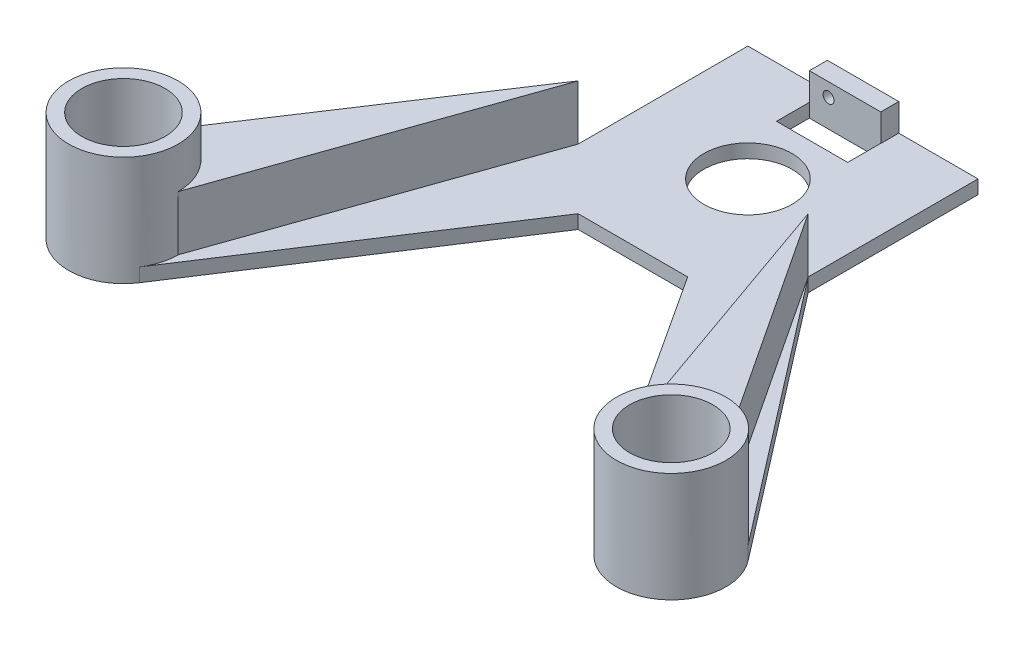
ISO-10303-21;
HEADER;
FILE_DESCRIPTION(('STEP AP214'),'2;1');
FILE_NAME('part.step','',(''),(''),'','','');
FILE_SCHEMA(('AUTOMOTIVE_DESIGN { 1 0 10303 214 1 1 1 1 }'));
ENDSEC;
DATA;
#1=APPLICATION_CONTEXT('core data for automotive mechanical design processes');
#2=APPLICATION_PROTOCOL_DEFINITION('international standard','automotive_design',2000,#1);
#3=PRODUCT_CONTEXT('',#1,'mechanical');
#4=PRODUCT('Part','Part','',(#3));
#5=PRODUCT_RELATED_PRODUCT_CATEGORY('part','',(#4));
#6=PRODUCT_DEFINITION_FORMATION('','',#4);
#7=PRODUCT_DEFINITION_CONTEXT('part definition',#1,'design');
#8=PRODUCT_DEFINITION('design','',#6,#7);
#9=PRODUCT_DEFINITION_SHAPE('','',#8);
#10=(LENGTH_UNIT() NAMED_UNIT(*) SI_UNIT(.MILLI.,.METRE.));
#11=(NAMED_UNIT(*) PLANE_ANGLE_UNIT() SI_UNIT($,.RADIAN.));
#12=(NAMED_UNIT(*) SI_UNIT($,.STERADIAN.) SOLID_ANGLE_UNIT());
#13=UNCERTAINTY_MEASURE_WITH_UNIT(LENGTH_MEASURE(1.E-05),#10,'distance_accuracy_value','');
#14=(GEOMETRIC_REPRESENTATION_CONTEXT(3) GLOBAL_UNCERTAINTY_ASSIGNED_CONTEXT((#13)) GLOBAL_UNIT_ASSIGNED_CONTEXT((#10,
#11,#12)) REPRESENTATION_CONTEXT('',''));
#15=CARTESIAN_POINT('',(0.,0.,0.));
#16=DIRECTION('',(0.,0.,1.));
#17=DIRECTION('',(1.,0.,0.));
#18=AXIS2_PLACEMENT_3D('',#15,#16,#17);
#19=CARTESIAN_POINT('',(0.,2.5,0.));
#20=DIRECTION('',(0.,-1.,0.));
#21=DIRECTION('',(0.,0.,-1.));
#22=AXIS2_PLACEMENT_3D('',#19,#20,#21);
#23=PLANE('',#22);
#24=CARTESIAN_POINT('',(0.,2.5,0.));
#25=DIRECTION('',(0.,1.,0.));
#26=DIRECTION('',(0.,0.,1.));
#27=AXIS2_PLACEMENT_3D('',#24,#25,#26);
#28=CIRCLE('',#27,8.05);
#29=CARTESIAN_POINT('',(0.,2.5,8.05));
#30=VERTEX_POINT('',#29);
#31=EDGE_CURVE('E377',#30,#30,#28,.T.);
#32=ORIENTED_EDGE('',*,*,#31,.F.);
#33=EDGE_LOOP('',(#32));
#34=FACE_BOUND('',#33,.T.);
#35=DIRECTION('',(0.,0.,1.));
#36=VECTOR('',#35,1.);
#37=CARTESIAN_POINT('',(-6.5,2.5,-17.7149420605666));
#38=LINE('',#37,#36);
#39=CARTESIAN_POINT('',(-6.5,2.5,-21.));
#40=VERTEX_POINT('',#39);
#41=CARTESIAN_POINT('',(-6.5,2.5,-17.7149420605666));
#42=VERTEX_POINT('',#41);
#43=EDGE_CURVE('E61',#40,#42,#38,.T.);
#44=ORIENTED_EDGE('',*,*,#43,.F.);
#45=DIRECTION('',(-1.,0.,0.));
#46=VECTOR('',#45,1.);
#47=CARTESIAN_POINT('',(-21.,2.5,-21.));
#48=LINE('',#47,#46);
#49=CARTESIAN_POINT('',(-21.,2.5,-21.));
#50=VERTEX_POINT('',#49);
#51=EDGE_CURVE('E385',#40,#50,#48,.T.);
#52=ORIENTED_EDGE('',*,*,#51,.T.);
#53=DIRECTION('',(0.,0.,1.));
#54=VECTOR('',#53,1.);
#55=CARTESIAN_POINT('',(-21.,2.5,21.));
#56=LINE('',#55,#54);
#57=CARTESIAN_POINT('',(-21.,2.5,9.99999999999999));
#58=VERTEX_POINT('',#57);
#59=EDGE_CURVE('E389',#50,#58,#56,.T.);
#60=ORIENTED_EDGE('',*,*,#59,.T.);
#61=DIRECTION('',(0.331906211589928,0.,-0.943312390837745));
#62=VECTOR('',#61,1.);
#63=CARTESIAN_POINT('',(-21.,2.5,9.99999999999999));
#64=LINE('',#63,#62);
#65=CARTESIAN_POINT('',(-39.9999999999521,2.5,64.0000000000478));
#66=VERTEX_POINT('',#65);
#67=EDGE_CURVE('E269',#66,#58,#64,.T.);
#68=ORIENTED_EDGE('',*,*,#67,.F.);
#69=CARTESIAN_POINT('',(-49.9999999999521,2.5,64.0000000000478));
#70=DIRECTION('',(0.,-1.,0.));
#71=DIRECTION('',(0.,0.,-1.));
#72=AXIS2_PLACEMENT_3D('',#69,#70,#71);
#73=CIRCLE('',#72,9.99999999999999);
#74=CARTESIAN_POINT('',(-41.6253017020287,2.5,69.4648356260076));
#75=VERTEX_POINT('',#74);
#76=EDGE_CURVE('E307',#66,#75,#73,.T.);
#77=ORIENTED_EDGE('',*,*,#76,.T.);
#78=DIRECTION('',(-0.546483562595981,0.,0.837469829792336));
#79=VECTOR('',#78,1.);
#80=CARTESIAN_POINT('',(2.59737626105884,2.5,1.69489500642385));
#81=LINE('',#80,#79);
#82=CARTESIAN_POINT('',(-10.,2.5,21.));
#83=VERTEX_POINT('',#82);
#84=EDGE_CURVE('E318',#83,#75,#81,.T.);
#85=ORIENTED_EDGE('',*,*,#84,.F.);
#86=DIRECTION('',(1.,0.,0.));
#87=VECTOR('',#86,1.);
#88=CARTESIAN_POINT('',(-21.,2.5,21.));
#89=LINE('',#88,#87);
#90=CARTESIAN_POINT('',(10.,2.5,21.));
#91=VERTEX_POINT('',#90);
#92=EDGE_CURVE('E392',#83,#91,#89,.T.);
#93=ORIENTED_EDGE('',*,*,#92,.T.);
#94=DIRECTION('',(0.546483562596984,0.,0.837469829791681));
#95=VECTOR('',#94,1.);
#96=CARTESIAN_POINT('',(-2.59737626107993,2.5,1.69489500644205));
#97=LINE('',#96,#95);
#98=CARTESIAN_POINT('',(41.6253017020857,2.5,69.4648356259681));
#99=VERTEX_POINT('',#98);
#100=EDGE_CURVE('E360',#91,#99,#97,.T.);
#101=ORIENTED_EDGE('',*,*,#100,.T.);
#102=CARTESIAN_POINT('',(50.0000000000025,2.5,63.9999999999982));
#103=DIRECTION('',(0.,-1.,0.));
#104=DIRECTION('',(0.,0.,-1.));
#105=AXIS2_PLACEMENT_3D('',#102,#103,#104);
#106=CIRCLE('',#105,10.);
#107=CARTESIAN_POINT('',(40.0000000000025,2.5,63.9999999999982));
#108=VERTEX_POINT('',#107);
#109=EDGE_CURVE('E298',#99,#108,#106,.T.);
#110=ORIENTED_EDGE('',*,*,#109,.T.);
#111=DIRECTION('',(0.331906211590982,0.,0.943312390837374));
#112=VECTOR('',#111,1.);
#113=CARTESIAN_POINT('',(21.,2.5,10.));
#114=LINE('',#113,#112);
#115=CARTESIAN_POINT('',(21.,2.5,10.));
#116=VERTEX_POINT('',#115);
#117=EDGE_CURVE('E251',#116,#108,#114,.T.);
#118=ORIENTED_EDGE('',*,*,#117,.F.);
#119=DIRECTION('',(0.,0.,-1.));
#120=VECTOR('',#119,1.);
#121=CARTESIAN_POINT('',(21.,2.5,21.));
#122=LINE('',#121,#120);
#123=CARTESIAN_POINT('',(21.,2.5,-21.));
#124=VERTEX_POINT('',#123);
#125=EDGE_CURVE('E383',#116,#124,#122,.T.);
#126=ORIENTED_EDGE('',*,*,#125,.T.);
#127=CARTESIAN_POINT('',(6.53314015738046,2.5,-21.));
#128=VERTEX_POINT('',#127);
#129=EDGE_CURVE('E387',#124,#128,#48,.T.);
#130=ORIENTED_EDGE('',*,*,#129,.T.);
#131=DIRECTION('',(0.,0.,-1.));
#132=VECTOR('',#131,1.);
#133=CARTESIAN_POINT('',(6.53314015738047,2.5,-17.7149420605666));
#134=LINE('',#133,#132);
#135=CARTESIAN_POINT('',(6.53314015738047,2.5,-17.7149420605666));
#136=VERTEX_POINT('',#135);
#137=EDGE_CURVE('E54',#136,#128,#134,.T.);
#138=ORIENTED_EDGE('',*,*,#137,.F.);
#139=DIRECTION('',(1.,0.,0.));
#140=VECTOR('',#139,1.);
#141=CARTESIAN_POINT('',(-6.5,2.5,-17.7149420605666));
#142=LINE('',#141,#140);
#143=CARTESIAN_POINT('',(6.50000000000001,2.5,-17.7149420605666));
#144=VERTEX_POINT('',#143);
#145=EDGE_CURVE('E756',#144,#136,#142,.T.);
#146=ORIENTED_EDGE('',*,*,#145,.F.);
#147=DIRECTION('',(0.,0.,1.));
#148=VECTOR('',#147,1.);
#149=CARTESIAN_POINT('',(6.5,2.5,0.));
#150=LINE('',#149,#148);
#151=CARTESIAN_POINT('',(6.5,2.5,-11.7149420605666));
#152=VERTEX_POINT('',#151);
#153=EDGE_CURVE('E233',#144,#152,#150,.T.);
#154=ORIENTED_EDGE('',*,*,#153,.T.);
#155=DIRECTION('',(-1.,0.,0.));
#156=VECTOR('',#155,1.);
#157=CARTESIAN_POINT('',(0.,2.5,-11.7149420605666));
#158=LINE('',#157,#156);
#159=CARTESIAN_POINT('',(-6.5,2.5,-11.7149420605666));
#160=VERTEX_POINT('',#159);
#161=EDGE_CURVE('E241',#152,#160,#158,.T.);
#162=ORIENTED_EDGE('',*,*,#161,.T.);
#163=DIRECTION('',(0.,0.,-1.));
#164=VECTOR('',#163,1.);
#165=CARTESIAN_POINT('',(-6.5,2.5,0.));
#166=LINE('',#165,#164);
#167=EDGE_CURVE('E244',#160,#42,#166,.T.);
#168=ORIENTED_EDGE('',*,*,#167,.T.);
#169=EDGE_LOOP('',(#44,#52,#60,#68,#77,#85,#93,#101,#110,#118,#126,#130,#138,#146,#154,#162,#168));
#170=FACE_BOUND('',#169,.T.);
#171=ADVANCED_FACE('F37',(#34,#170),#23,.F.);
#172=DIRECTION('',(-0.550313362133871,0.,-0.834958204616803));
#173=VECTOR('',#172,1.);
#174=CARTESIAN_POINT('',(21.,2.5,10.));
#175=LINE('',#174,#173);
#176=CARTESIAN_POINT('',(50.0000000000025,2.5,53.9999999999982));
#177=VERTEX_POINT('',#176);
#178=EDGE_CURVE('E246',#177,#116,#175,.T.);
#179=ORIENTED_EDGE('',*,*,#178,.F.);
#180=CARTESIAN_POINT('',(57.9200140129701,2.5,57.8948072893299));
#181=VERTEX_POINT('',#180);
#182=EDGE_CURVE('E297',#177,#181,#106,.T.);
#183=ORIENTED_EDGE('',*,*,#182,.T.);
#184=DIRECTION('',(0.610519271066832,0.,0.792001401296755));
#185=VECTOR('',#184,1.);
#186=CARTESIAN_POINT('',(8.33726943074045,2.5,-6.42683667883594));
#187=LINE('',#186,#185);
#188=EDGE_CURVE('E349',#116,#181,#187,.T.);
#189=ORIENTED_EDGE('',*,*,#188,.F.);
#190=EDGE_LOOP('',(#179,#183,#189));
#191=FACE_BOUND('',#190,.T.);
#192=ADVANCED_FACE('F465',(#191),#23,.F.);
#193=CARTESIAN_POINT('',(50.0000000000025,0.,63.9999999999982));
#194=DIRECTION('',(0.,1.,0.));
#195=DIRECTION('',(0.,0.,1.));
#196=AXIS2_PLACEMENT_3D('',#193,#194,#195);
#197=CYLINDRICAL_SURFACE('',#196,10.);
#198=CARTESIAN_POINT('',(50.0000000000025,20.,63.9999999999982));
#199=DIRECTION('',(0.,-1.,0.));
#200=DIRECTION('',(0.,0.,-1.));
#201=AXIS2_PLACEMENT_3D('',#198,#199,#200);
#202=CIRCLE('',#201,10.);
#203=CARTESIAN_POINT('',(50.0000000000025,20.,53.9999999999982));
#204=VERTEX_POINT('',#203);
#205=EDGE_CURVE('E294',#204,#204,#202,.T.);
#206=ORIENTED_EDGE('',*,*,#205,.T.);
#207=EDGE_LOOP('',(#206));
#208=FACE_BOUND('',#207,.T.);
#209=ORIENTED_EDGE('',*,*,#182,.F.);
#210=DIRECTION('',(0.,-1.,0.));
#211=VECTOR('',#210,1.);
#212=CARTESIAN_POINT('',(50.0000000000025,12.5,53.9999999999982));
#213=LINE('',#212,#211);
#214=CARTESIAN_POINT('',(50.0000000000025,12.5,53.9999999999982));
#215=VERTEX_POINT('',#214);
#216=EDGE_CURVE('E257',#215,#177,#213,.T.);
#217=ORIENTED_EDGE('',*,*,#216,.F.);
#218=CARTESIAN_POINT('',(50.0000000000025,12.5,63.9999999999982));
#219=DIRECTION('',(0.,-1.,0.));
#220=DIRECTION('',(0.,0.,1.));
#221=AXIS2_PLACEMENT_3D('',#218,#219,#220);
#222=CIRCLE('',#221,10.);
#223=CARTESIAN_POINT('',(40.0000000000025,12.5,63.9999999999982));
#224=VERTEX_POINT('',#223);
#225=EDGE_CURVE('E254',#224,#215,#222,.T.);
#226=ORIENTED_EDGE('',*,*,#225,.F.);
#227=DIRECTION('',(0.,-1.,0.));
#228=VECTOR('',#227,1.);
#229=CARTESIAN_POINT('',(40.0000000000025,12.5,63.9999999999982));
#230=LINE('',#229,#228);
#231=EDGE_CURVE('E264',#224,#108,#230,.T.);
#232=ORIENTED_EDGE('',*,*,#231,.T.);
#233=ORIENTED_EDGE('',*,*,#109,.F.);
#234=DIRECTION('',(0.,1.,0.));
#235=VECTOR('',#234,1.);
#236=CARTESIAN_POINT('',(41.6253017020857,0.,69.4648356259681));
#237=LINE('',#236,#235);
#238=CARTESIAN_POINT('',(41.6253017020857,0.,69.4648356259681));
#239=VERTEX_POINT('',#238);
#240=EDGE_CURVE('E357',#239,#99,#237,.T.);
#241=ORIENTED_EDGE('',*,*,#240,.F.);
#242=CARTESIAN_POINT('',(50.0000000000025,0.,63.9999999999982));
#243=DIRECTION('',(0.,1.,0.));
#244=DIRECTION('',(0.,0.,1.));
#245=AXIS2_PLACEMENT_3D('',#242,#243,#244);
#246=CIRCLE('',#245,10.);
#247=CARTESIAN_POINT('',(57.9200140129701,0.,57.8948072893299));
#248=VERTEX_POINT('',#247);
#249=EDGE_CURVE('E352',#239,#248,#246,.T.);
#250=ORIENTED_EDGE('',*,*,#249,.T.);
#251=DIRECTION('',(0.,1.,0.));
#252=VECTOR('',#251,1.);
#253=CARTESIAN_POINT('',(57.9200140129701,0.,57.8948072893299));
#254=LINE('',#253,#252);
#255=EDGE_CURVE('E372',#248,#181,#254,.T.);
#256=ORIENTED_EDGE('',*,*,#255,.T.);
#257=EDGE_LOOP('',(#209,#217,#226,#232,#233,#241,#250,#256));
#258=FACE_BOUND('',#257,.T.);
#259=ADVANCED_FACE('F455',(#208,#258),#197,.T.);
#260=DIRECTION('',(-0.550313362132772,0.,0.834958204617527));
#261=VECTOR('',#260,1.);
#262=CARTESIAN_POINT('',(-49.9999999999521,2.5,54.0000000000478));
#263=LINE('',#262,#261);
#264=CARTESIAN_POINT('',(-49.9999999999521,2.5,54.0000000000478));
#265=VERTEX_POINT('',#264);
#266=EDGE_CURVE('E274',#58,#265,#263,.T.);
#267=ORIENTED_EDGE('',*,*,#266,.F.);
#268=DIRECTION('',(-0.610519271065913,0.,0.792001401297464));
#269=VECTOR('',#268,1.);
#270=CARTESIAN_POINT('',(-8.33726943076698,2.5,-6.42683667884096));
#271=LINE('',#270,#269);
#272=CARTESIAN_POINT('',(-57.9200140129267,2.5,57.8948072893887));
#273=VERTEX_POINT('',#272);
#274=EDGE_CURVE('E329',#58,#273,#271,.T.);
#275=ORIENTED_EDGE('',*,*,#274,.T.);
#276=EDGE_CURVE('E308',#273,#265,#73,.T.);
#277=ORIENTED_EDGE('',*,*,#276,.T.);
#278=EDGE_LOOP('',(#267,#275,#277));
#279=FACE_BOUND('',#278,.T.);
#280=ADVANCED_FACE('F482',(#279),#23,.F.);
#281=CARTESIAN_POINT('',(-49.9999999999521,0.,64.0000000000478));
#282=DIRECTION('',(0.,1.,0.));
#283=DIRECTION('',(0.,0.,1.));
#284=AXIS2_PLACEMENT_3D('',#281,#282,#283);
#285=CYLINDRICAL_SURFACE('',#284,10.);
#286=CARTESIAN_POINT('',(-49.9999999999521,20.,64.0000000000478));
#287=DIRECTION('',(0.,-1.,0.));
#288=DIRECTION('',(0.,0.,-1.));
#289=AXIS2_PLACEMENT_3D('',#286,#287,#288);
#290=CIRCLE('',#289,9.99999999999999);
#291=CARTESIAN_POINT('',(-49.9999999999521,20.,54.0000000000478));
#292=VERTEX_POINT('',#291);
#293=EDGE_CURVE('E304',#292,#292,#290,.T.);
#294=ORIENTED_EDGE('',*,*,#293,.T.);
#295=EDGE_LOOP('',(#294));
#296=FACE_BOUND('',#295,.T.);
#297=ORIENTED_EDGE('',*,*,#76,.F.);
#298=DIRECTION('',(0.,-1.,0.));
#299=VECTOR('',#298,1.);
#300=CARTESIAN_POINT('',(-39.9999999999521,12.5,64.0000000000478));
#301=LINE('',#300,#299);
#302=CARTESIAN_POINT('',(-39.9999999999521,12.5,64.0000000000478));
#303=VERTEX_POINT('',#302);
#304=EDGE_CURVE('E288',#303,#66,#301,.T.);
#305=ORIENTED_EDGE('',*,*,#304,.F.);
#306=CARTESIAN_POINT('',(-49.9999999999521,12.5,64.0000000000478));
#307=DIRECTION('',(0.,-1.,0.));
#308=DIRECTION('',(0.,0.,1.));
#309=AXIS2_PLACEMENT_3D('',#306,#307,#308);
#310=CIRCLE('',#309,9.99999999999999);
#311=CARTESIAN_POINT('',(-49.9999999999521,12.5,54.0000000000478));
#312=VERTEX_POINT('',#311);
#313=EDGE_CURVE('E270',#312,#303,#310,.T.);
#314=ORIENTED_EDGE('',*,*,#313,.F.);
#315=DIRECTION('',(0.,-1.,0.));
#316=VECTOR('',#315,1.);
#317=CARTESIAN_POINT('',(-49.9999999999521,12.5,54.0000000000478));
#318=LINE('',#317,#316);
#319=EDGE_CURVE('E279',#312,#265,#318,.T.);
#320=ORIENTED_EDGE('',*,*,#319,.T.);
#321=ORIENTED_EDGE('',*,*,#276,.F.);
#322=DIRECTION('',(0.,1.,0.));
#323=VECTOR('',#322,1.);
#324=CARTESIAN_POINT('',(-57.9200140129267,0.,57.8948072893887));
#325=LINE('',#324,#323);
#326=CARTESIAN_POINT('',(-57.9200140129267,0.,57.8948072893887));
#327=VERTEX_POINT('',#326);
#328=EDGE_CURVE('E326',#327,#273,#325,.T.);
#329=ORIENTED_EDGE('',*,*,#328,.F.);
#330=CARTESIAN_POINT('',(-49.9999999999521,0.,64.0000000000478));
#331=DIRECTION('',(0.,1.,0.));
#332=DIRECTION('',(0.,0.,1.));
#333=AXIS2_PLACEMENT_3D('',#330,#331,#332);
#334=CIRCLE('',#333,10.);
#335=CARTESIAN_POINT('',(-41.6253017020287,0.,69.4648356260076));
#336=VERTEX_POINT('',#335);
#337=EDGE_CURVE('E321',#327,#336,#334,.T.);
#338=ORIENTED_EDGE('',*,*,#337,.T.);
#339=DIRECTION('',(0.,1.,0.));
#340=VECTOR('',#339,1.);
#341=CARTESIAN_POINT('',(-41.6253017020287,0.,69.4648356260076));
#342=LINE('',#341,#340);
#343=EDGE_CURVE('E340',#336,#75,#342,.T.);
#344=ORIENTED_EDGE('',*,*,#343,.T.);
#345=EDGE_LOOP('',(#297,#305,#314,#320,#321,#329,#338,#344));
#346=FACE_BOUND('',#345,.T.);
#347=ADVANCED_FACE('F437',(#296,#346),#285,.T.);
#348=CARTESIAN_POINT('',(50.0000000000025,2.5,63.9999999999982));
#349=DIRECTION('',(0.,1.,0.));
#350=DIRECTION('',(0.,0.,1.));
#351=AXIS2_PLACEMENT_3D('',#348,#349,#350);
#352=CIRCLE('',#351,4.05);
#353=CARTESIAN_POINT('',(50.0000000000025,2.5,68.0499999999982));
#354=VERTEX_POINT('',#353);
#355=EDGE_CURVE('E337',#354,#354,#352,.T.);
#356=ORIENTED_EDGE('',*,*,#355,.F.);
#357=EDGE_LOOP('',(#356));
#358=FACE_BOUND('',#357,.T.);
#359=CARTESIAN_POINT('',(50.0000000000025,2.5,63.9999999999982));
#360=DIRECTION('',(0.,-1.,0.));
#361=DIRECTION('',(0.,0.,-1.));
#362=AXIS2_PLACEMENT_3D('',#359,#360,#361);
#363=CIRCLE('',#362,7.59999999999708);
#364=CARTESIAN_POINT('',(50.0000000000025,2.5,56.4000000000011));
#365=VERTEX_POINT('',#364);
#366=EDGE_CURVE('E11',#365,#365,#363,.T.);
#367=ORIENTED_EDGE('',*,*,#366,.F.);
#368=EDGE_LOOP('',(#367));
#369=FACE_BOUND('',#368,.T.);
#370=ADVANCED_FACE('F492',(#358,#369),#23,.F.);
#371=CARTESIAN_POINT('',(-49.9999999999521,2.5,64.0000000000478));
#372=DIRECTION('',(0.,1.,0.));
#373=DIRECTION('',(0.,0.,1.));
#374=AXIS2_PLACEMENT_3D('',#371,#372,#373);
#375=CIRCLE('',#374,4.05);
#376=CARTESIAN_POINT('',(-49.9999999999521,2.5,68.0500000000478));
#377=VERTEX_POINT('',#376);
#378=EDGE_CURVE('E311',#377,#377,#375,.T.);
#379=ORIENTED_EDGE('',*,*,#378,.F.);
#380=EDGE_LOOP('',(#379));
#381=FACE_BOUND('',#380,.T.);
#382=CARTESIAN_POINT('',(-49.9999999999521,2.5,64.0000000000478));
#383=DIRECTION('',(0.,-1.,0.));
#384=DIRECTION('',(0.,0.,-1.));
#385=AXIS2_PLACEMENT_3D('',#382,#383,#384);
#386=CIRCLE('',#385,7.59999999996798);
#387=CARTESIAN_POINT('',(-49.9999999999521,2.5,56.4000000000798));
#388=VERTEX_POINT('',#387);
#389=EDGE_CURVE('E46',#388,#388,#386,.T.);
#390=ORIENTED_EDGE('',*,*,#389,.F.);
#391=EDGE_LOOP('',(#390));
#392=FACE_BOUND('',#391,.T.);
#393=ADVANCED_FACE('F486',(#381,#392),#23,.F.);
#394=CARTESIAN_POINT('',(-21.,2.5,21.));
#395=DIRECTION('',(0.,0.,-1.));
#396=DIRECTION('',(-1.,0.,0.));
#397=AXIS2_PLACEMENT_3D('',#394,#395,#396);
#398=PLANE('',#397);
#399=DIRECTION('',(0.,1.,0.));
#400=VECTOR('',#399,1.);
#401=CARTESIAN_POINT('',(-10.,0.,21.));
#402=LINE('',#401,#400);
#403=CARTESIAN_POINT('',(-10.,0.,21.));
#404=VERTEX_POINT('',#403);
#405=EDGE_CURVE('E338',#404,#83,#402,.T.);
#406=ORIENTED_EDGE('',*,*,#405,.F.);
#407=DIRECTION('',(1.,0.,0.));
#408=VECTOR('',#407,1.);
#409=CARTESIAN_POINT('',(-21.,0.,21.));
#410=LINE('',#409,#408);
#411=CARTESIAN_POINT('',(10.,0.,21.));
#412=VERTEX_POINT('',#411);
#413=EDGE_CURVE('E386',#404,#412,#410,.T.);
#414=ORIENTED_EDGE('',*,*,#413,.T.);
#415=DIRECTION('',(0.,1.,0.));
#416=VECTOR('',#415,1.);
#417=CARTESIAN_POINT('',(10.,0.,21.));
#418=LINE('',#417,#416);
#419=EDGE_CURVE('E365',#412,#91,#418,.T.);
#420=ORIENTED_EDGE('',*,*,#419,.T.);
#421=ORIENTED_EDGE('',*,*,#92,.F.);
#422=EDGE_LOOP('',(#406,#414,#420,#421));
#423=FACE_BOUND('',#422,.T.);
#424=ADVANCED_FACE('F445',(#423),#398,.F.);
#425=CARTESIAN_POINT('',(21.,2.5,21.));
#426=DIRECTION('',(-1.,0.,0.));
#427=DIRECTION('',(0.,0.,1.));
#428=AXIS2_PLACEMENT_3D('',#425,#426,#427);
#429=PLANE('',#428);
#430=DIRECTION('',(0.,1.,0.));
#431=VECTOR('',#430,1.);
#432=CARTESIAN_POINT('',(21.,0.,10.));
#433=LINE('',#432,#431);
#434=CARTESIAN_POINT('',(21.,0.,10.));
#435=VERTEX_POINT('',#434);
#436=EDGE_CURVE('E369',#435,#116,#433,.T.);
#437=ORIENTED_EDGE('',*,*,#436,.F.);
#438=DIRECTION('',(0.,0.,-1.));
#439=VECTOR('',#438,1.);
#440=CARTESIAN_POINT('',(21.,0.,21.));
#441=LINE('',#440,#439);
#442=CARTESIAN_POINT('',(21.,0.,-21.));
#443=VERTEX_POINT('',#442);
#444=EDGE_CURVE('E380',#435,#443,#441,.T.);
#445=ORIENTED_EDGE('',*,*,#444,.T.);
#446=DIRECTION('',(0.,-1.,0.));
#447=VECTOR('',#446,1.);
#448=CARTESIAN_POINT('',(21.,2.5,-21.));
#449=LINE('',#448,#447);
#450=EDGE_CURVE('E41',#124,#443,#449,.T.);
#451=ORIENTED_EDGE('',*,*,#450,.F.);
#452=ORIENTED_EDGE('',*,*,#125,.F.);
#453=EDGE_LOOP('',(#437,#445,#451,#452));
#454=FACE_BOUND('',#453,.T.);
#455=ADVANCED_FACE('F39',(#454),#429,.F.);
#456=CARTESIAN_POINT('',(0.,0.,0.));
#457=DIRECTION('',(0.,-1.,0.));
#458=DIRECTION('',(0.,0.,-1.));
#459=AXIS2_PLACEMENT_3D('',#456,#457,#458);
#460=PLANE('',#459);
#461=DIRECTION('',(0.,0.,-1.));
#462=VECTOR('',#461,1.);
#463=CARTESIAN_POINT('',(-6.5,0.,-17.7149420605666));
#464=LINE('',#463,#462);
#465=CARTESIAN_POINT('',(-6.5,0.,-11.7149420605666));
#466=VERTEX_POINT('',#465);
#467=CARTESIAN_POINT('',(-6.5,0.,-17.7149420605666));
#468=VERTEX_POINT('',#467);
#469=EDGE_CURVE('E214',#466,#468,#464,.T.);
#470=ORIENTED_EDGE('',*,*,#469,.F.);
#471=DIRECTION('',(-1.,0.,0.));
#472=VECTOR('',#471,1.);
#473=CARTESIAN_POINT('',(6.5,0.,-11.7149420605666));
#474=LINE('',#473,#472);
#475=CARTESIAN_POINT('',(6.5,0.,-11.7149420605666));
#476=VERTEX_POINT('',#475);
#477=EDGE_CURVE('E227',#476,#466,#474,.T.);
#478=ORIENTED_EDGE('',*,*,#477,.F.);
#479=DIRECTION('',(0.,0.,1.));
#480=VECTOR('',#479,1.);
#481=CARTESIAN_POINT('',(6.50000000000001,0.,-17.7149420605666));
#482=LINE('',#481,#480);
#483=CARTESIAN_POINT('',(6.50000000000001,0.,-17.7149420605666));
#484=VERTEX_POINT('',#483);
#485=EDGE_CURVE('E224',#484,#476,#482,.T.);
#486=ORIENTED_EDGE('',*,*,#485,.F.);
#487=DIRECTION('',(1.,0.,0.));
#488=VECTOR('',#487,1.);
#489=CARTESIAN_POINT('',(6.50000000000001,0.,-17.7149420605666));
#490=LINE('',#489,#488);
#491=EDGE_CURVE('E216',#468,#484,#490,.T.);
#492=ORIENTED_EDGE('',*,*,#491,.F.);
#493=EDGE_LOOP('',(#470,#478,#486,#492));
#494=FACE_BOUND('',#493,.T.);
#495=DIRECTION('',(0.610519271066832,0.,0.792001401296755));
#496=VECTOR('',#495,1.);
#497=CARTESIAN_POINT('',(8.33726943074045,0.,-6.42683667883594));
#498=LINE('',#497,#496);
#499=EDGE_CURVE('E355',#435,#248,#498,.T.);
#500=ORIENTED_EDGE('',*,*,#499,.T.);
#501=ORIENTED_EDGE('',*,*,#249,.F.);
#502=DIRECTION('',(0.546483562596984,0.,0.837469829791681));
#503=VECTOR('',#502,1.);
#504=CARTESIAN_POINT('',(-2.59737626107993,0.,1.69489500644205));
#505=LINE('',#504,#503);
#506=EDGE_CURVE('E348',#412,#239,#505,.T.);
#507=ORIENTED_EDGE('',*,*,#506,.F.);
#508=ORIENTED_EDGE('',*,*,#413,.F.);
#509=DIRECTION('',(-0.546483562595981,0.,0.837469829792336));
#510=VECTOR('',#509,1.);
#511=CARTESIAN_POINT('',(2.59737626105884,0.,1.69489500642385));
#512=LINE('',#511,#510);
#513=EDGE_CURVE('E324',#404,#336,#512,.T.);
#514=ORIENTED_EDGE('',*,*,#513,.T.);
#515=ORIENTED_EDGE('',*,*,#337,.F.);
#516=DIRECTION('',(-0.610519271065913,0.,0.792001401297464));
#517=VECTOR('',#516,1.);
#518=CARTESIAN_POINT('',(-8.33726943076698,0.,-6.42683667884096));
#519=LINE('',#518,#517);
#520=CARTESIAN_POINT('',(-21.,0.,9.99999999999999));
#521=VERTEX_POINT('',#520);
#522=EDGE_CURVE('E317',#521,#327,#519,.T.);
#523=ORIENTED_EDGE('',*,*,#522,.F.);
#524=DIRECTION('',(0.,0.,1.));
#525=VECTOR('',#524,1.);
#526=CARTESIAN_POINT('',(-21.,0.,21.));
#527=LINE('',#526,#525);
#528=CARTESIAN_POINT('',(-21.,0.,-21.));
#529=VERTEX_POINT('',#528);
#530=EDGE_CURVE('E398',#529,#521,#527,.T.);
#531=ORIENTED_EDGE('',*,*,#530,.F.);
#532=DIRECTION('',(-1.,0.,0.));
#533=VECTOR('',#532,1.);
#534=CARTESIAN_POINT('',(-21.,0.,-21.));
#535=LINE('',#534,#533);
#536=EDGE_CURVE('E396',#443,#529,#535,.T.);
#537=ORIENTED_EDGE('',*,*,#536,.F.);
#538=ORIENTED_EDGE('',*,*,#444,.F.);
#539=EDGE_LOOP('',(#500,#501,#507,#508,#514,#515,#523,#531,#537,#538));
#540=FACE_BOUND('',#539,.T.);
#541=CARTESIAN_POINT('',(0.,0.,0.));
#542=DIRECTION('',(0.,1.,0.));
#543=DIRECTION('',(0.,0.,1.));
#544=AXIS2_PLACEMENT_3D('',#541,#542,#543);
#545=CIRCLE('',#544,8.05);
#546=CARTESIAN_POINT('',(0.,0.,8.05));
#547=VERTEX_POINT('',#546);
#548=EDGE_CURVE('E368',#547,#547,#545,.T.);
#549=ORIENTED_EDGE('',*,*,#548,.T.);
#550=EDGE_LOOP('',(#549));
#551=FACE_BOUND('',#550,.T.);
#552=CARTESIAN_POINT('',(-49.9999999999521,0.,64.0000000000478));
#553=DIRECTION('',(0.,1.,0.));
#554=DIRECTION('',(0.,0.,1.));
#555=AXIS2_PLACEMENT_3D('',#552,#553,#554);
#556=CIRCLE('',#555,4.05);
#557=CARTESIAN_POINT('',(-49.9999999999521,0.,68.0500000000478));
#558=VERTEX_POINT('',#557);
#559=EDGE_CURVE('E314',#558,#558,#556,.T.);
#560=ORIENTED_EDGE('',*,*,#559,.T.);
#561=EDGE_LOOP('',(#560));
#562=FACE_BOUND('',#561,.T.);
#563=CARTESIAN_POINT('',(50.0000000000025,0.,63.9999999999982));
#564=DIRECTION('',(0.,1.,0.));
#565=DIRECTION('',(0.,0.,1.));
#566=AXIS2_PLACEMENT_3D('',#563,#564,#565);
#567=CIRCLE('',#566,4.05);
#568=CARTESIAN_POINT('',(50.0000000000025,0.,68.0499999999982));
#569=VERTEX_POINT('',#568);
#570=EDGE_CURVE('E345',#569,#569,#567,.T.);
#571=ORIENTED_EDGE('',*,*,#570,.T.);
#572=EDGE_LOOP('',(#571));
#573=FACE_BOUND('',#572,.T.);
#574=ADVANCED_FACE('F418',(#494,#540,#551,#562,#573),#460,.T.);
#575=CARTESIAN_POINT('',(-21.,2.5,-21.));
#576=DIRECTION('',(0.,0.,1.));
#577=DIRECTION('',(1.,0.,0.));
#578=AXIS2_PLACEMENT_3D('',#575,#576,#577);
#579=PLANE('',#578);
#580=CARTESIAN_POINT('',(-2.9958222498514,5.02374701204937,-21.));
#581=DIRECTION('',(0.,0.,1.));
#582=DIRECTION('',(1.,0.,0.));
#583=AXIS2_PLACEMENT_3D('',#580,#581,#582);
#584=CIRCLE('',#583,1.);
#585=CARTESIAN_POINT('',(-1.9958222498514,5.02374701204937,-21.));
#586=VERTEX_POINT('',#585);
#587=EDGE_CURVE('E754',#586,#586,#584,.T.);
#588=ORIENTED_EDGE('',*,*,#587,.T.);
#589=EDGE_LOOP('',(#588));
#590=FACE_BOUND('',#589,.T.);
#591=ORIENTED_EDGE('',*,*,#536,.T.);
#592=DIRECTION('',(0.,-1.,0.));
#593=VECTOR('',#592,1.);
#594=CARTESIAN_POINT('',(-21.,2.5,-21.));
#595=LINE('',#594,#593);
#596=EDGE_CURVE('E394',#50,#529,#595,.T.);
#597=ORIENTED_EDGE('',*,*,#596,.F.);
#598=ORIENTED_EDGE('',*,*,#51,.F.);
#599=DIRECTION('',(0.,-1.,0.));
#600=VECTOR('',#599,1.);
#601=CARTESIAN_POINT('',(-6.5,7.5,-21.));
#602=LINE('',#601,#600);
#603=CARTESIAN_POINT('',(-6.5,7.5,-21.));
#604=VERTEX_POINT('',#603);
#605=EDGE_CURVE('E761',#604,#40,#602,.T.);
#606=ORIENTED_EDGE('',*,*,#605,.F.);
#607=DIRECTION('',(-1.,0.,0.));
#608=VECTOR('',#607,1.);
#609=CARTESIAN_POINT('',(-6.5,7.5,-21.));
#610=LINE('',#609,#608);
#611=CARTESIAN_POINT('',(6.53314015738047,7.5,-21.));
#612=VERTEX_POINT('',#611);
#613=EDGE_CURVE('E208',#612,#604,#610,.T.);
#614=ORIENTED_EDGE('',*,*,#613,.F.);
#615=DIRECTION('',(0.,-1.,0.));
#616=VECTOR('',#615,1.);
#617=CARTESIAN_POINT('',(6.53314015738047,7.5,-21.));
#618=LINE('',#617,#616);
#619=EDGE_CURVE('E218',#612,#128,#618,.T.);
#620=ORIENTED_EDGE('',*,*,#619,.T.);
#621=ORIENTED_EDGE('',*,*,#129,.F.);
#622=ORIENTED_EDGE('',*,*,#450,.T.);
#623=EDGE_LOOP('',(#591,#597,#598,#606,#614,#620,#621,#622));
#624=FACE_BOUND('',#623,.T.);
#625=ADVANCED_FACE('F410',(#590,#624),#579,.F.);
#626=CARTESIAN_POINT('',(-21.,2.5,21.));
#627=DIRECTION('',(1.,0.,0.));
#628=DIRECTION('',(0.,0.,-1.));
#629=AXIS2_PLACEMENT_3D('',#626,#627,#628);
#630=PLANE('',#629);
#631=ORIENTED_EDGE('',*,*,#530,.T.);
#632=DIRECTION('',(0.,1.,0.));
#633=VECTOR('',#632,1.);
#634=CARTESIAN_POINT('',(-21.,0.,9.99999999999999));
#635=LINE('',#634,#633);
#636=EDGE_CURVE('E334',#521,#58,#635,.T.);
#637=ORIENTED_EDGE('',*,*,#636,.T.);
#638=ORIENTED_EDGE('',*,*,#59,.F.);
#639=ORIENTED_EDGE('',*,*,#596,.T.);
#640=EDGE_LOOP('',(#631,#637,#638,#639));
#641=FACE_BOUND('',#640,.T.);
#642=ADVANCED_FACE('F422',(#641),#630,.F.);
#643=CARTESIAN_POINT('',(0.,2.5,0.));
#644=DIRECTION('',(0.,-1.,0.));
#645=DIRECTION('',(0.,0.,-1.));
#646=AXIS2_PLACEMENT_3D('',#643,#644,#645);
#647=CYLINDRICAL_SURFACE('',#646,8.05);
#648=ORIENTED_EDGE('',*,*,#31,.T.);
#649=EDGE_LOOP('',(#648));
#650=FACE_BOUND('',#649,.T.);
#651=ORIENTED_EDGE('',*,*,#548,.F.);
#652=EDGE_LOOP('',(#651));
#653=FACE_BOUND('',#652,.T.);
#654=ADVANCED_FACE('F550',(#650,#653),#647,.F.);
#655=CARTESIAN_POINT('',(-2.59737626107993,0.,1.69489500644205));
#656=DIRECTION('',(-0.837469829791682,0.,0.546483562596984));
#657=DIRECTION('',(0.546483562596984,0.,0.837469829791682));
#658=AXIS2_PLACEMENT_3D('',#655,#656,#657);
#659=PLANE('',#658);
#660=ORIENTED_EDGE('',*,*,#100,.F.);
#661=ORIENTED_EDGE('',*,*,#419,.F.);
#662=ORIENTED_EDGE('',*,*,#506,.T.);
#663=ORIENTED_EDGE('',*,*,#240,.T.);
#664=EDGE_LOOP('',(#660,#661,#662,#663));
#665=FACE_BOUND('',#664,.T.);
#666=ADVANCED_FACE('F450',(#665),#659,.T.);
#667=CARTESIAN_POINT('',(8.33726943074045,0.,-6.42683667883594));
#668=DIRECTION('',(-0.792001401296755,0.,0.610519271066833));
#669=DIRECTION('',(0.610519271066833,0.,0.792001401296755));
#670=AXIS2_PLACEMENT_3D('',#667,#668,#669);
#671=PLANE('',#670);
#672=ORIENTED_EDGE('',*,*,#188,.T.);
#673=ORIENTED_EDGE('',*,*,#255,.F.);
#674=ORIENTED_EDGE('',*,*,#499,.F.);
#675=ORIENTED_EDGE('',*,*,#436,.T.);
#676=EDGE_LOOP('',(#672,#673,#674,#675));
#677=FACE_BOUND('',#676,.T.);
#678=ADVANCED_FACE('F544',(#677),#671,.F.);
#679=CARTESIAN_POINT('',(50.0000000000025,0.,63.9999999999982));
#680=DIRECTION('',(0.,1.,0.));
#681=DIRECTION('',(0.,0.,1.));
#682=AXIS2_PLACEMENT_3D('',#679,#680,#681);
#683=CYLINDRICAL_SURFACE('',#682,4.05);
#684=ORIENTED_EDGE('',*,*,#570,.F.);
#685=EDGE_LOOP('',(#684));
#686=FACE_BOUND('',#685,.T.);
#687=ORIENTED_EDGE('',*,*,#355,.T.);
#688=EDGE_LOOP('',(#687));
#689=FACE_BOUND('',#688,.T.);
#690=ADVANCED_FACE('F540',(#686,#689),#683,.F.);
#691=CARTESIAN_POINT('',(-8.33726943076698,0.,-6.42683667884096));
#692=DIRECTION('',(-0.792001401297464,0.,-0.610519271065913));
#693=DIRECTION('',(-0.610519271065913,0.,0.792001401297464));
#694=AXIS2_PLACEMENT_3D('',#691,#692,#693);
#695=PLANE('',#694);
#696=ORIENTED_EDGE('',*,*,#274,.F.);
#697=ORIENTED_EDGE('',*,*,#636,.F.);
#698=ORIENTED_EDGE('',*,*,#522,.T.);
#699=ORIENTED_EDGE('',*,*,#328,.T.);
#700=EDGE_LOOP('',(#696,#697,#698,#699));
#701=FACE_BOUND('',#700,.T.);
#702=ADVANCED_FACE('F536',(#701),#695,.T.);
#703=CARTESIAN_POINT('',(2.59737626105884,0.,1.69489500642385));
#704=DIRECTION('',(-0.837469829792336,0.,-0.546483562595981));
#705=DIRECTION('',(-0.546483562595981,0.,0.837469829792336));
#706=AXIS2_PLACEMENT_3D('',#703,#704,#705);
#707=PLANE('',#706);
#708=ORIENTED_EDGE('',*,*,#84,.T.);
#709=ORIENTED_EDGE('',*,*,#343,.F.);
#710=ORIENTED_EDGE('',*,*,#513,.F.);
#711=ORIENTED_EDGE('',*,*,#405,.T.);
#712=EDGE_LOOP('',(#708,#709,#710,#711));
#713=FACE_BOUND('',#712,.T.);
#714=ADVANCED_FACE('F534',(#713),#707,.F.);
#715=CARTESIAN_POINT('',(-49.9999999999521,0.,64.0000000000478));
#716=DIRECTION('',(0.,1.,0.));
#717=DIRECTION('',(0.,0.,1.));
#718=AXIS2_PLACEMENT_3D('',#715,#716,#717);
#719=CYLINDRICAL_SURFACE('',#718,4.05);
#720=ORIENTED_EDGE('',*,*,#559,.F.);
#721=EDGE_LOOP('',(#720));
#722=FACE_BOUND('',#721,.T.);
#723=ORIENTED_EDGE('',*,*,#378,.T.);
#724=EDGE_LOOP('',(#723));
#725=FACE_BOUND('',#724,.T.);
#726=ADVANCED_FACE('F531',(#722,#725),#719,.F.);
#727=CARTESIAN_POINT('',(-49.9999999999521,20.,64.0000000000478));
#728=DIRECTION('',(0.,-1.,0.));
#729=DIRECTION('',(0.,0.,-1.));
#730=AXIS2_PLACEMENT_3D('',#727,#728,#729);
#731=CYLINDRICAL_SURFACE('',#730,7.59999999996798);
#732=CARTESIAN_POINT('',(-49.9999999999521,20.,64.0000000000478));
#733=DIRECTION('',(0.,-1.,0.));
#734=DIRECTION('',(0.,0.,-1.));
#735=AXIS2_PLACEMENT_3D('',#732,#733,#734);
#736=CIRCLE('',#735,7.59999999996798);
#737=CARTESIAN_POINT('',(-49.9999999999521,20.,56.4000000000798));
#738=VERTEX_POINT('',#737);
#739=EDGE_CURVE('E300',#738,#738,#736,.T.);
#740=ORIENTED_EDGE('',*,*,#739,.F.);
#741=EDGE_LOOP('',(#740));
#742=FACE_BOUND('',#741,.T.);
#743=ORIENTED_EDGE('',*,*,#389,.T.);
#744=EDGE_LOOP('',(#743));
#745=FACE_BOUND('',#744,.T.);
#746=ADVANCED_FACE('F523',(#742,#745),#731,.F.);
#747=CARTESIAN_POINT('',(-49.9999999999521,20.,64.0000000000478));
#748=DIRECTION('',(0.,-1.,0.));
#749=DIRECTION('',(0.,0.,-1.));
#750=AXIS2_PLACEMENT_3D('',#747,#748,#749);
#751=PLANE('',#750);
#752=ORIENTED_EDGE('',*,*,#739,.T.);
#753=EDGE_LOOP('',(#752));
#754=FACE_BOUND('',#753,.T.);
#755=ORIENTED_EDGE('',*,*,#293,.F.);
#756=EDGE_LOOP('',(#755));
#757=FACE_BOUND('',#756,.T.);
#758=ADVANCED_FACE('F514',(#754,#757),#751,.F.);
#759=CARTESIAN_POINT('',(50.0000000000025,20.,63.9999999999982));
#760=DIRECTION('',(0.,-1.,0.));
#761=DIRECTION('',(0.,0.,-1.));
#762=AXIS2_PLACEMENT_3D('',#759,#760,#761);
#763=CYLINDRICAL_SURFACE('',#762,7.59999999999708);
#764=CARTESIAN_POINT('',(50.0000000000025,20.,63.9999999999982));
#765=DIRECTION('',(0.,-1.,0.));
#766=DIRECTION('',(0.,0.,-1.));
#767=AXIS2_PLACEMENT_3D('',#764,#765,#766);
#768=CIRCLE('',#767,7.59999999999708);
#769=CARTESIAN_POINT('',(50.0000000000025,20.,56.4000000000011));
#770=VERTEX_POINT('',#769);
#771=EDGE_CURVE('E291',#770,#770,#768,.T.);
#772=ORIENTED_EDGE('',*,*,#771,.F.);
#773=EDGE_LOOP('',(#772));
#774=FACE_BOUND('',#773,.T.);
#775=ORIENTED_EDGE('',*,*,#366,.T.);
#776=EDGE_LOOP('',(#775));
#777=FACE_BOUND('',#776,.T.);
#778=ADVANCED_FACE('F511',(#774,#777),#763,.F.);
#779=CARTESIAN_POINT('',(50.0000000000025,20.,63.9999999999982));
#780=DIRECTION('',(0.,-1.,0.));
#781=DIRECTION('',(0.,0.,-1.));
#782=AXIS2_PLACEMENT_3D('',#779,#780,#781);
#783=PLANE('',#782);
#784=ORIENTED_EDGE('',*,*,#771,.T.);
#785=EDGE_LOOP('',(#784));
#786=FACE_BOUND('',#785,.T.);
#787=ORIENTED_EDGE('',*,*,#205,.F.);
#788=EDGE_LOOP('',(#787));
#789=FACE_BOUND('',#788,.T.);
#790=ADVANCED_FACE('F513',(#786,#789),#783,.F.);
#791=CARTESIAN_POINT('',(-21.,12.5,9.99999999999999));
#792=DIRECTION('',(-0.943312390837745,0.,-0.331906211589928));
#793=DIRECTION('',(-0.331906211589928,0.,0.943312390837745));
#794=AXIS2_PLACEMENT_3D('',#791,#792,#793);
#795=PLANE('',#794);
#796=ORIENTED_EDGE('',*,*,#67,.T.);
#797=DIRECTION('',(0.,-1.,0.));
#798=VECTOR('',#797,1.);
#799=CARTESIAN_POINT('',(-21.,12.5,9.99999999999999));
#800=LINE('',#799,#798);
#801=CARTESIAN_POINT('',(-21.,12.5,9.99999999999999));
#802=VERTEX_POINT('',#801);
#803=EDGE_CURVE('E285',#802,#58,#800,.T.);
#804=ORIENTED_EDGE('',*,*,#803,.F.);
#805=DIRECTION('',(0.331906211589928,0.,-0.943312390837745));
#806=VECTOR('',#805,1.);
#807=CARTESIAN_POINT('',(-21.,12.5,9.99999999999999));
#808=LINE('',#807,#806);
#809=EDGE_CURVE('E273',#303,#802,#808,.T.);
#810=ORIENTED_EDGE('',*,*,#809,.F.);
#811=ORIENTED_EDGE('',*,*,#304,.T.);
#812=EDGE_LOOP('',(#796,#804,#810,#811));
#813=FACE_BOUND('',#812,.T.);
#814=ADVANCED_FACE('F428',(#813),#795,.F.);
#815=CARTESIAN_POINT('',(-49.9999999999521,12.5,54.0000000000478));
#816=DIRECTION('',(0.834958204617527,0.,0.550313362132772));
#817=DIRECTION('',(0.550313362132772,0.,-0.834958204617527));
#818=AXIS2_PLACEMENT_3D('',#815,#816,#817);
#819=PLANE('',#818);
#820=ORIENTED_EDGE('',*,*,#266,.T.);
#821=ORIENTED_EDGE('',*,*,#319,.F.);
#822=DIRECTION('',(-0.550313362132772,0.,0.834958204617527));
#823=VECTOR('',#822,1.);
#824=CARTESIAN_POINT('',(-49.9999999999521,12.5,54.0000000000478));
#825=LINE('',#824,#823);
#826=EDGE_CURVE('E276',#802,#312,#825,.T.);
#827=ORIENTED_EDGE('',*,*,#826,.F.);
#828=ORIENTED_EDGE('',*,*,#803,.T.);
#829=EDGE_LOOP('',(#820,#821,#827,#828));
#830=FACE_BOUND('',#829,.T.);
#831=ADVANCED_FACE('F432',(#830),#819,.F.);
#832=CARTESIAN_POINT('',(-49.9999999999521,12.5,64.0000000000478));
#833=DIRECTION('',(0.,1.,0.));
#834=DIRECTION('',(0.,0.,1.));
#835=AXIS2_PLACEMENT_3D('',#832,#833,#834);
#836=PLANE('',#835);
#837=ORIENTED_EDGE('',*,*,#313,.T.);
#838=ORIENTED_EDGE('',*,*,#809,.T.);
#839=ORIENTED_EDGE('',*,*,#826,.T.);
#840=EDGE_LOOP('',(#837,#838,#839));
#841=FACE_BOUND('',#840,.T.);
#842=ADVANCED_FACE('F435',(#841),#836,.T.);
#843=CARTESIAN_POINT('',(21.,12.5,10.));
#844=DIRECTION('',(-0.834958204616803,0.,0.550313362133871));
#845=DIRECTION('',(0.550313362133871,0.,0.834958204616803));
#846=AXIS2_PLACEMENT_3D('',#843,#844,#845);
#847=PLANE('',#846);
#848=ORIENTED_EDGE('',*,*,#178,.T.);
#849=DIRECTION('',(0.,-1.,0.));
#850=VECTOR('',#849,1.);
#851=CARTESIAN_POINT('',(21.,12.5,10.));
#852=LINE('',#851,#850);
#853=CARTESIAN_POINT('',(21.,12.5,10.));
#854=VERTEX_POINT('',#853);
#855=EDGE_CURVE('E266',#854,#116,#852,.T.);
#856=ORIENTED_EDGE('',*,*,#855,.F.);
#857=DIRECTION('',(-0.550313362133871,0.,-0.834958204616803));
#858=VECTOR('',#857,1.);
#859=CARTESIAN_POINT('',(21.,12.5,10.));
#860=LINE('',#859,#858);
#861=EDGE_CURVE('E247',#215,#854,#860,.T.);
#862=ORIENTED_EDGE('',*,*,#861,.F.);
#863=ORIENTED_EDGE('',*,*,#216,.T.);
#864=EDGE_LOOP('',(#848,#856,#862,#863));
#865=FACE_BOUND('',#864,.T.);
#866=ADVANCED_FACE('F463',(#865),#847,.F.);
#867=CARTESIAN_POINT('',(21.,12.5,10.));
#868=DIRECTION('',(0.943312390837374,0.,-0.331906211590982));
#869=DIRECTION('',(-0.331906211590982,0.,-0.943312390837374));
#870=AXIS2_PLACEMENT_3D('',#867,#868,#869);
#871=PLANE('',#870);
#872=ORIENTED_EDGE('',*,*,#117,.T.);
#873=ORIENTED_EDGE('',*,*,#231,.F.);
#874=DIRECTION('',(0.331906211590982,0.,0.943312390837374));
#875=VECTOR('',#874,1.);
#876=CARTESIAN_POINT('',(21.,12.5,10.));
#877=LINE('',#876,#875);
#878=EDGE_CURVE('E250',#854,#224,#877,.T.);
#879=ORIENTED_EDGE('',*,*,#878,.F.);
#880=ORIENTED_EDGE('',*,*,#855,.T.);
#881=EDGE_LOOP('',(#872,#873,#879,#880));
#882=FACE_BOUND('',#881,.T.);
#883=ADVANCED_FACE('F459',(#882),#871,.F.);
#884=CARTESIAN_POINT('',(50.0000000000025,12.5,63.9999999999982));
#885=DIRECTION('',(0.,1.,0.));
#886=DIRECTION('',(0.,0.,1.));
#887=AXIS2_PLACEMENT_3D('',#884,#885,#886);
#888=PLANE('',#887);
#889=ORIENTED_EDGE('',*,*,#861,.T.);
#890=ORIENTED_EDGE('',*,*,#878,.T.);
#891=ORIENTED_EDGE('',*,*,#225,.T.);
#892=EDGE_LOOP('',(#889,#890,#891));
#893=FACE_BOUND('',#892,.T.);
#894=ADVANCED_FACE('F467',(#893),#888,.T.);
#895=CARTESIAN_POINT('',(-6.5,10.,-17.7149420605666));
#896=DIRECTION('',(-1.,0.,0.));
#897=DIRECTION('',(0.,0.,1.));
#898=AXIS2_PLACEMENT_3D('',#895,#896,#897);
#899=PLANE('',#898);
#900=DIRECTION('',(0.,-1.,0.));
#901=VECTOR('',#900,1.);
#902=CARTESIAN_POINT('',(-6.5,10.,-11.7149420605666));
#903=LINE('',#902,#901);
#904=EDGE_CURVE('E231',#160,#466,#903,.T.);
#905=ORIENTED_EDGE('',*,*,#904,.T.);
#906=ORIENTED_EDGE('',*,*,#469,.T.);
#907=DIRECTION('',(0.,-1.,0.));
#908=VECTOR('',#907,1.);
#909=CARTESIAN_POINT('',(-6.5,10.,-17.7149420605666));
#910=LINE('',#909,#908);
#911=EDGE_CURVE('E230',#42,#468,#910,.T.);
#912=ORIENTED_EDGE('',*,*,#911,.F.);
#913=ORIENTED_EDGE('',*,*,#167,.F.);
#914=EDGE_LOOP('',(#905,#906,#912,#913));
#915=FACE_BOUND('',#914,.T.);
#916=ADVANCED_FACE('F469',(#915),#899,.F.);
#917=CARTESIAN_POINT('',(6.5,10.,-11.7149420605666));
#918=DIRECTION('',(0.,0.,1.));
#919=DIRECTION('',(1.,0.,0.));
#920=AXIS2_PLACEMENT_3D('',#917,#918,#919);
#921=PLANE('',#920);
#922=DIRECTION('',(0.,-1.,0.));
#923=VECTOR('',#922,1.);
#924=CARTESIAN_POINT('',(6.5,10.,-11.7149420605666));
#925=LINE('',#924,#923);
#926=EDGE_CURVE('E234',#152,#476,#925,.T.);
#927=ORIENTED_EDGE('',*,*,#926,.T.);
#928=ORIENTED_EDGE('',*,*,#477,.T.);
#929=ORIENTED_EDGE('',*,*,#904,.F.);
#930=ORIENTED_EDGE('',*,*,#161,.F.);
#931=EDGE_LOOP('',(#927,#928,#929,#930));
#932=FACE_BOUND('',#931,.T.);
#933=ADVANCED_FACE('F475',(#932),#921,.F.);
#934=CARTESIAN_POINT('',(6.50000000000001,10.,-17.7149420605666));
#935=DIRECTION('',(1.,0.,0.));
#936=DIRECTION('',(0.,0.,-1.));
#937=AXIS2_PLACEMENT_3D('',#934,#935,#936);
#938=PLANE('',#937);
#939=DIRECTION('',(0.,-1.,0.));
#940=VECTOR('',#939,1.);
#941=CARTESIAN_POINT('',(6.50000000000001,10.,-17.7149420605666));
#942=LINE('',#941,#940);
#943=EDGE_CURVE('E236',#144,#484,#942,.T.);
#944=ORIENTED_EDGE('',*,*,#943,.T.);
#945=ORIENTED_EDGE('',*,*,#485,.T.);
#946=ORIENTED_EDGE('',*,*,#926,.F.);
#947=ORIENTED_EDGE('',*,*,#153,.F.);
#948=EDGE_LOOP('',(#944,#945,#946,#947));
#949=FACE_BOUND('',#948,.T.);
#950=ADVANCED_FACE('F672',(#949),#938,.F.);
#951=CARTESIAN_POINT('',(6.50000000000001,10.,-17.7149420605666));
#952=DIRECTION('',(0.,0.,-1.));
#953=DIRECTION('',(-1.,0.,0.));
#954=AXIS2_PLACEMENT_3D('',#951,#952,#953);
#955=PLANE('',#954);
#956=CARTESIAN_POINT('',(-2.9958222498514,5.02374701204937,-17.7149420605666));
#957=DIRECTION('',(0.,0.,1.));
#958=DIRECTION('',(1.,0.,0.));
#959=AXIS2_PLACEMENT_3D('',#956,#957,#958);
#960=CIRCLE('',#959,1.);
#961=CARTESIAN_POINT('',(-1.9958222498514,5.02374701204937,-17.7149420605666));
#962=VERTEX_POINT('',#961);
#963=EDGE_CURVE('E751',#962,#962,#960,.T.);
#964=ORIENTED_EDGE('',*,*,#963,.F.);
#965=EDGE_LOOP('',(#964));
#966=FACE_BOUND('',#965,.T.);
#967=ORIENTED_EDGE('',*,*,#911,.T.);
#968=ORIENTED_EDGE('',*,*,#491,.T.);
#969=ORIENTED_EDGE('',*,*,#943,.F.);
#970=ORIENTED_EDGE('',*,*,#145,.T.);
#971=DIRECTION('',(0.,-1.,0.));
#972=VECTOR('',#971,1.);
#973=CARTESIAN_POINT('',(6.53314015738047,7.5,-17.7149420605666));
#974=LINE('',#973,#972);
#975=CARTESIAN_POINT('',(6.53314015738047,7.5,-17.7149420605666));
#976=VERTEX_POINT('',#975);
#977=EDGE_CURVE('E199',#976,#136,#974,.T.);
#978=ORIENTED_EDGE('',*,*,#977,.F.);
#979=DIRECTION('',(1.,0.,0.));
#980=VECTOR('',#979,1.);
#981=CARTESIAN_POINT('',(-6.5,7.5,-17.7149420605666));
#982=LINE('',#981,#980);
#983=CARTESIAN_POINT('',(-6.5,7.5,-17.7149420605666));
#984=VERTEX_POINT('',#983);
#985=EDGE_CURVE('E192',#984,#976,#982,.T.);
#986=ORIENTED_EDGE('',*,*,#985,.F.);
#987=DIRECTION('',(0.,-1.,0.));
#988=VECTOR('',#987,1.);
#989=CARTESIAN_POINT('',(-6.5,7.5,-17.7149420605666));
#990=LINE('',#989,#988);
#991=EDGE_CURVE('E197',#984,#42,#990,.T.);
#992=ORIENTED_EDGE('',*,*,#991,.T.);
#993=EDGE_LOOP('',(#967,#968,#969,#970,#978,#986,#992));
#994=FACE_BOUND('',#993,.T.);
#995=ADVANCED_FACE('F195',(#966,#994),#955,.F.);
#996=CARTESIAN_POINT('',(-6.5,7.5,-17.7149420605666));
#997=DIRECTION('',(1.,0.,0.));
#998=DIRECTION('',(0.,0.,-1.));
#999=AXIS2_PLACEMENT_3D('',#996,#997,#998);
#1000=PLANE('',#999);
#1001=ORIENTED_EDGE('',*,*,#43,.T.);
#1002=ORIENTED_EDGE('',*,*,#991,.F.);
#1003=DIRECTION('',(0.,0.,1.));
#1004=VECTOR('',#1003,1.);
#1005=CARTESIAN_POINT('',(-6.5,7.5,-17.7149420605666));
#1006=LINE('',#1005,#1004);
#1007=EDGE_CURVE('E203',#604,#984,#1006,.T.);
#1008=ORIENTED_EDGE('',*,*,#1007,.F.);
#1009=ORIENTED_EDGE('',*,*,#605,.T.);
#1010=EDGE_LOOP('',(#1001,#1002,#1008,#1009));
#1011=FACE_BOUND('',#1010,.T.);
#1012=ADVANCED_FACE('F213',(#1011),#1000,.F.);
#1013=CARTESIAN_POINT('',(6.53314015738047,7.5,-17.7149420605666));
#1014=DIRECTION('',(-1.,0.,0.));
#1015=DIRECTION('',(0.,0.,1.));
#1016=AXIS2_PLACEMENT_3D('',#1013,#1014,#1015);
#1017=PLANE('',#1016);
#1018=ORIENTED_EDGE('',*,*,#137,.T.);
#1019=ORIENTED_EDGE('',*,*,#619,.F.);
#1020=DIRECTION('',(0.,0.,-1.));
#1021=VECTOR('',#1020,1.);
#1022=CARTESIAN_POINT('',(6.53314015738047,7.5,-17.7149420605666));
#1023=LINE('',#1022,#1021);
#1024=EDGE_CURVE('E202',#976,#612,#1023,.T.);
#1025=ORIENTED_EDGE('',*,*,#1024,.F.);
#1026=ORIENTED_EDGE('',*,*,#977,.T.);
#1027=EDGE_LOOP('',(#1018,#1019,#1025,#1026));
#1028=FACE_BOUND('',#1027,.T.);
#1029=ADVANCED_FACE('F704',(#1028),#1017,.F.);
#1030=CARTESIAN_POINT('',(0.,7.5,0.));
#1031=DIRECTION('',(0.,-1.,0.));
#1032=DIRECTION('',(0.,0.,-1.));
#1033=AXIS2_PLACEMENT_3D('',#1030,#1031,#1032);
#1034=PLANE('',#1033);
#1035=ORIENTED_EDGE('',*,*,#1007,.T.);
#1036=ORIENTED_EDGE('',*,*,#985,.T.);
#1037=ORIENTED_EDGE('',*,*,#1024,.T.);
#1038=ORIENTED_EDGE('',*,*,#613,.T.);
#1039=EDGE_LOOP('',(#1035,#1036,#1037,#1038));
#1040=FACE_BOUND('',#1039,.T.);
#1041=ADVANCED_FACE('F206',(#1040),#1034,.F.);
#1042=CARTESIAN_POINT('',(-2.9958222498514,5.02374701204937,-27.7149420605666));
#1043=DIRECTION('',(0.,0.,1.));
#1044=DIRECTION('',(1.,0.,0.));
#1045=AXIS2_PLACEMENT_3D('',#1042,#1043,#1044);
#1046=CYLINDRICAL_SURFACE('',#1045,1.);
#1047=ORIENTED_EDGE('',*,*,#963,.T.);
#1048=EDGE_LOOP('',(#1047));
#1049=FACE_BOUND('',#1048,.T.);
#1050=ORIENTED_EDGE('',*,*,#587,.F.);
#1051=EDGE_LOOP('',(#1050));
#1052=FACE_BOUND('',#1051,.T.);
#1053=ADVANCED_FACE('F723',(#1049,#1052),#1046,.F.);
#1054=CLOSED_SHELL('',(#171,#192,#259,#280,#347,#370,#393,#424,#455,#574,#625,#642,#654,#666,
#678,#690,#702,#714,#726,#746,#758,#778,#790,#814,#831,#842,#866,#883,#894,#916,#933,#950,#995,
#1012,#1029,#1041,#1053));
#1055=MANIFOLD_SOLID_BREP('B2',#1054);
#1056=ADVANCED_BREP_SHAPE_REPRESENTATION('',(#18,#1055),#14);
#1057=SHAPE_DEFINITION_REPRESENTATION(#9,#1056);
ENDSEC;
END-ISO-10303-21;
